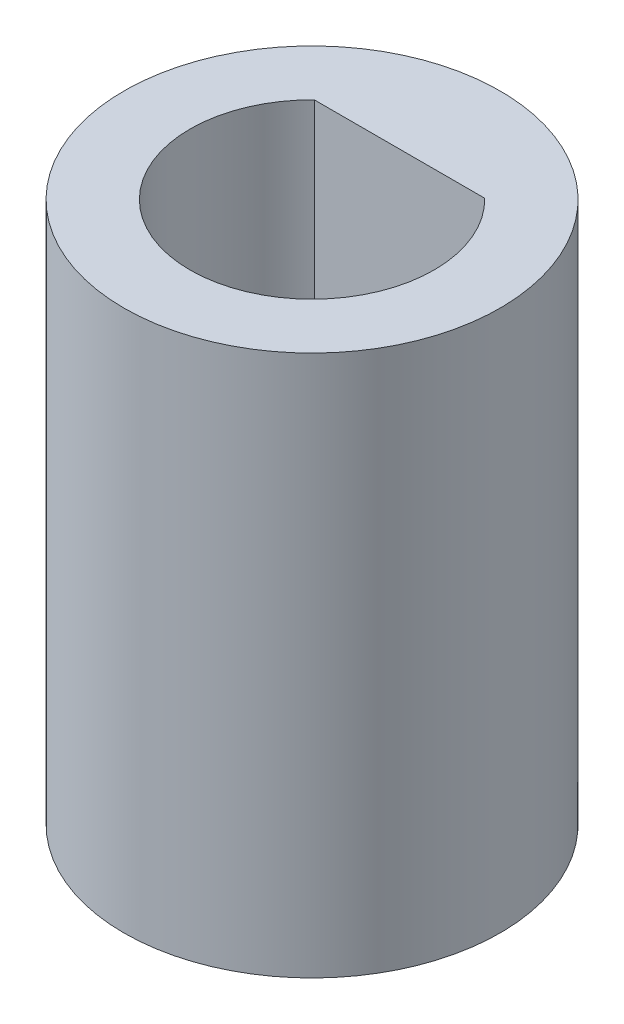
ISO-10303-21;
HEADER;
FILE_DESCRIPTION(('STEP AP214'),'2;1');
FILE_NAME('part.step','',(''),(''),'','','');
FILE_SCHEMA(('AUTOMOTIVE_DESIGN { 1 0 10303 214 1 1 1 1 }'));
ENDSEC;
DATA;
#1=APPLICATION_CONTEXT('core data for automotive mechanical design processes');
#2=APPLICATION_PROTOCOL_DEFINITION('international standard','automotive_design',2000,#1);
#3=PRODUCT_CONTEXT('',#1,'mechanical');
#4=PRODUCT('Part','Part','',(#3));
#5=PRODUCT_RELATED_PRODUCT_CATEGORY('part','',(#4));
#6=PRODUCT_DEFINITION_FORMATION('','',#4);
#7=PRODUCT_DEFINITION_CONTEXT('part definition',#1,'design');
#8=PRODUCT_DEFINITION('design','',#6,#7);
#9=PRODUCT_DEFINITION_SHAPE('','',#8);
#10=(LENGTH_UNIT() NAMED_UNIT(*) SI_UNIT(.MILLI.,.METRE.));
#11=(NAMED_UNIT(*) PLANE_ANGLE_UNIT() SI_UNIT($,.RADIAN.));
#12=(NAMED_UNIT(*) SI_UNIT($,.STERADIAN.) SOLID_ANGLE_UNIT());
#13=UNCERTAINTY_MEASURE_WITH_UNIT(LENGTH_MEASURE(1.E-05),#10,'distance_accuracy_value','');
#14=(GEOMETRIC_REPRESENTATION_CONTEXT(3) GLOBAL_UNCERTAINTY_ASSIGNED_CONTEXT((#13)) GLOBAL_UNIT_ASSIGNED_CONTEXT((#10,
#11,#12)) REPRESENTATION_CONTEXT('',''));
#15=CARTESIAN_POINT('',(0.,0.,0.));
#16=DIRECTION('',(0.,0.,1.));
#17=DIRECTION('',(1.,0.,0.));
#18=AXIS2_PLACEMENT_3D('',#15,#16,#17);
#19=CARTESIAN_POINT('',(0.,-16.4,0.));
#20=DIRECTION('',(0.,1.,0.));
#21=DIRECTION('',(0.,0.,1.));
#22=AXIS2_PLACEMENT_3D('',#19,#20,#21);
#23=CYLINDRICAL_SURFACE('',#22,5.7);
#24=CARTESIAN_POINT('',(0.,-16.4,0.));
#25=DIRECTION('',(0.,1.,0.));
#26=DIRECTION('',(0.,0.,1.));
#27=AXIS2_PLACEMENT_3D('',#24,#25,#26);
#28=CIRCLE('',#27,5.7);
#29=CARTESIAN_POINT('',(0.,-16.4,5.7));
#30=VERTEX_POINT('',#29);
#31=EDGE_CURVE('E11',#30,#30,#28,.T.);
#32=ORIENTED_EDGE('',*,*,#31,.T.);
#33=EDGE_LOOP('',(#32));
#34=FACE_BOUND('',#33,.T.);
#35=CARTESIAN_POINT('',(0.,0.,0.));
#36=DIRECTION('',(0.,1.,0.));
#37=DIRECTION('',(0.,0.,1.));
#38=AXIS2_PLACEMENT_3D('',#35,#36,#37);
#39=CIRCLE('',#38,5.7);
#40=CARTESIAN_POINT('',(0.,0.,5.7));
#41=VERTEX_POINT('',#40);
#42=EDGE_CURVE('E36',#41,#41,#39,.T.);
#43=ORIENTED_EDGE('',*,*,#42,.F.);
#44=EDGE_LOOP('',(#43));
#45=FACE_BOUND('',#44,.T.);
#46=ADVANCED_FACE('F33',(#34,#45),#23,.T.);
#47=CARTESIAN_POINT('',(0.,-16.4,0.));
#48=DIRECTION('',(0.,1.,0.));
#49=DIRECTION('',(0.,0.,1.));
#50=AXIS2_PLACEMENT_3D('',#47,#48,#49);
#51=PLANE('',#50);
#52=DIRECTION('',(-1.,0.,0.));
#53=VECTOR('',#52,1.);
#54=CARTESIAN_POINT('',(-2.58215026673507,-16.4,-2.65));
#55=LINE('',#54,#53);
#56=CARTESIAN_POINT('',(2.58215026673507,-16.4,-2.65));
#57=VERTEX_POINT('',#56);
#58=CARTESIAN_POINT('',(-2.58215026673507,-16.4,-2.65));
#59=VERTEX_POINT('',#58);
#60=EDGE_CURVE('E74',#57,#59,#55,.T.);
#61=ORIENTED_EDGE('',*,*,#60,.T.);
#62=CARTESIAN_POINT('',(0.,-16.4,0.));
#63=DIRECTION('',(0.,1.,0.));
#64=DIRECTION('',(0.,0.,1.));
#65=AXIS2_PLACEMENT_3D('',#62,#63,#64);
#66=CIRCLE('',#65,3.7);
#67=EDGE_CURVE('E47',#59,#57,#66,.T.);
#68=ORIENTED_EDGE('',*,*,#67,.T.);
#69=EDGE_LOOP('',(#61,#68));
#70=FACE_BOUND('',#69,.T.);
#71=ORIENTED_EDGE('',*,*,#31,.F.);
#72=EDGE_LOOP('',(#71));
#73=FACE_BOUND('',#72,.T.);
#74=ADVANCED_FACE('F78',(#70,#73),#51,.F.);
#75=CARTESIAN_POINT('',(0.,0.,0.));
#76=DIRECTION('',(0.,1.,0.));
#77=DIRECTION('',(0.,0.,1.));
#78=AXIS2_PLACEMENT_3D('',#75,#76,#77);
#79=PLANE('',#78);
#80=CARTESIAN_POINT('',(0.,0.,0.));
#81=DIRECTION('',(0.,1.,0.));
#82=DIRECTION('',(0.,0.,1.));
#83=AXIS2_PLACEMENT_3D('',#80,#81,#82);
#84=CIRCLE('',#83,3.7);
#85=CARTESIAN_POINT('',(-2.58215026673507,0.,-2.65));
#86=VERTEX_POINT('',#85);
#87=CARTESIAN_POINT('',(2.58215026673507,0.,-2.65));
#88=VERTEX_POINT('',#87);
#89=EDGE_CURVE('E52',#86,#88,#84,.T.);
#90=ORIENTED_EDGE('',*,*,#89,.F.);
#91=DIRECTION('',(-1.,0.,0.));
#92=VECTOR('',#91,1.);
#93=CARTESIAN_POINT('',(-2.58215026673507,0.,-2.65));
#94=LINE('',#93,#92);
#95=EDGE_CURVE('E66',#88,#86,#94,.T.);
#96=ORIENTED_EDGE('',*,*,#95,.F.);
#97=EDGE_LOOP('',(#90,#96));
#98=FACE_BOUND('',#97,.T.);
#99=ORIENTED_EDGE('',*,*,#42,.T.);
#100=EDGE_LOOP('',(#99));
#101=FACE_BOUND('',#100,.T.);
#102=ADVANCED_FACE('F70',(#98,#101),#79,.T.);
#103=CARTESIAN_POINT('',(0.,-16.4,0.));
#104=DIRECTION('',(0.,1.,0.));
#105=DIRECTION('',(0.,0.,1.));
#106=AXIS2_PLACEMENT_3D('',#103,#104,#105);
#107=CYLINDRICAL_SURFACE('',#106,3.7);
#108=ORIENTED_EDGE('',*,*,#89,.T.);
#109=DIRECTION('',(0.,1.,0.));
#110=VECTOR('',#109,1.);
#111=CARTESIAN_POINT('',(2.58215026673507,-16.4,-2.65));
#112=LINE('',#111,#110);
#113=EDGE_CURVE('E63',#57,#88,#112,.T.);
#114=ORIENTED_EDGE('',*,*,#113,.F.);
#115=ORIENTED_EDGE('',*,*,#67,.F.);
#116=DIRECTION('',(0.,1.,0.));
#117=VECTOR('',#116,1.);
#118=CARTESIAN_POINT('',(-2.58215026673507,-16.4,-2.65));
#119=LINE('',#118,#117);
#120=EDGE_CURVE('E57',#59,#86,#119,.T.);
#121=ORIENTED_EDGE('',*,*,#120,.T.);
#122=EDGE_LOOP('',(#108,#114,#115,#121));
#123=FACE_BOUND('',#122,.T.);
#124=ADVANCED_FACE('F59',(#123),#107,.F.);
#125=CARTESIAN_POINT('',(-2.58215026673507,-16.4,-2.65));
#126=DIRECTION('',(0.,0.,-1.));
#127=DIRECTION('',(-1.,0.,0.));
#128=AXIS2_PLACEMENT_3D('',#125,#126,#127);
#129=PLANE('',#128);
#130=ORIENTED_EDGE('',*,*,#95,.T.);
#131=ORIENTED_EDGE('',*,*,#120,.F.);
#132=ORIENTED_EDGE('',*,*,#60,.F.);
#133=ORIENTED_EDGE('',*,*,#113,.T.);
#134=EDGE_LOOP('',(#130,#131,#132,#133));
#135=FACE_BOUND('',#134,.T.);
#136=ADVANCED_FACE('F67',(#135),#129,.F.);
#137=CLOSED_SHELL('',(#46,#74,#102,#124,#136));
#138=MANIFOLD_SOLID_BREP('B2',#137);
#139=ADVANCED_BREP_SHAPE_REPRESENTATION('',(#18,#138),#14);
#140=SHAPE_DEFINITION_REPRESENTATION(#9,#139);
ENDSEC;
END-ISO-10303-21;
